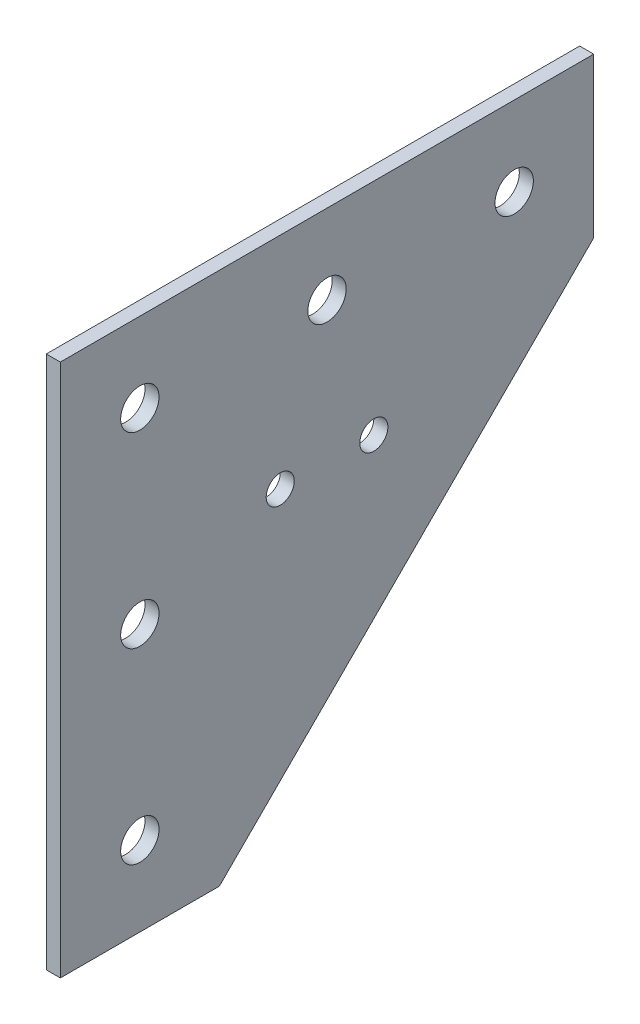
ISO-10303-21;
HEADER;
FILE_DESCRIPTION(('STEP AP214'),'2;1');
FILE_NAME('part.step','',(''),(''),'','','');
FILE_SCHEMA(('AUTOMOTIVE_DESIGN { 1 0 10303 214 1 1 1 1 }'));
ENDSEC;
DATA;
#1=APPLICATION_CONTEXT('core data for automotive mechanical design processes');
#2=APPLICATION_PROTOCOL_DEFINITION('international standard','automotive_design',2000,#1);
#3=PRODUCT_CONTEXT('',#1,'mechanical');
#4=PRODUCT('Part','Part','',(#3));
#5=PRODUCT_RELATED_PRODUCT_CATEGORY('part','',(#4));
#6=PRODUCT_DEFINITION_FORMATION('','',#4);
#7=PRODUCT_DEFINITION_CONTEXT('part definition',#1,'design');
#8=PRODUCT_DEFINITION('design','',#6,#7);
#9=PRODUCT_DEFINITION_SHAPE('','',#8);
#10=(LENGTH_UNIT() NAMED_UNIT(*) SI_UNIT(.MILLI.,.METRE.));
#11=(NAMED_UNIT(*) PLANE_ANGLE_UNIT() SI_UNIT($,.RADIAN.));
#12=(NAMED_UNIT(*) SI_UNIT($,.STERADIAN.) SOLID_ANGLE_UNIT());
#13=UNCERTAINTY_MEASURE_WITH_UNIT(LENGTH_MEASURE(1.E-05),#10,'distance_accuracy_value','');
#14=(GEOMETRIC_REPRESENTATION_CONTEXT(3) GLOBAL_UNCERTAINTY_ASSIGNED_CONTEXT((#13)) GLOBAL_UNIT_ASSIGNED_CONTEXT((#10,
#11,#12)) REPRESENTATION_CONTEXT('',''));
#15=CARTESIAN_POINT('',(0.,0.,0.));
#16=DIRECTION('',(0.,0.,1.));
#17=DIRECTION('',(1.,0.,0.));
#18=AXIS2_PLACEMENT_3D('',#15,#16,#17);
#19=CARTESIAN_POINT('',(3.,57.,-57.));
#20=DIRECTION('',(0.,0.,1.));
#21=DIRECTION('',(0.,-1.,0.));
#22=AXIS2_PLACEMENT_3D('',#19,#20,#21);
#23=PLANE('',#22);
#24=DIRECTION('',(0.,1.,0.));
#25=VECTOR('',#24,1.);
#26=CARTESIAN_POINT('',(3.,57.,-57.));
#27=LINE('',#26,#25);
#28=CARTESIAN_POINT('',(3.,23.,-57.));
#29=VERTEX_POINT('',#28);
#30=CARTESIAN_POINT('',(3.,57.,-57.));
#31=VERTEX_POINT('',#30);
#32=EDGE_CURVE('E81',#29,#31,#27,.T.);
#33=ORIENTED_EDGE('',*,*,#32,.F.);
#34=DIRECTION('',(1.,0.,0.));
#35=VECTOR('',#34,1.);
#36=CARTESIAN_POINT('',(0.,23.,-57.));
#37=LINE('',#36,#35);
#38=CARTESIAN_POINT('',(0.,23.,-57.));
#39=VERTEX_POINT('',#38);
#40=EDGE_CURVE('E92',#39,#29,#37,.T.);
#41=ORIENTED_EDGE('',*,*,#40,.F.);
#42=DIRECTION('',(0.,1.,0.));
#43=VECTOR('',#42,1.);
#44=CARTESIAN_POINT('',(0.,57.,-57.));
#45=LINE('',#44,#43);
#46=CARTESIAN_POINT('',(0.,57.,-57.));
#47=VERTEX_POINT('',#46);
#48=EDGE_CURVE('E101',#39,#47,#45,.T.);
#49=ORIENTED_EDGE('',*,*,#48,.T.);
#50=DIRECTION('',(-1.,0.,0.));
#51=VECTOR('',#50,1.);
#52=CARTESIAN_POINT('',(3.,57.,-57.));
#53=LINE('',#52,#51);
#54=EDGE_CURVE('E11',#31,#47,#53,.T.);
#55=ORIENTED_EDGE('',*,*,#54,.F.);
#56=EDGE_LOOP('',(#33,#41,#49,#55));
#57=FACE_BOUND('',#56,.T.);
#58=ADVANCED_FACE('F36',(#57),#23,.F.);
#59=CARTESIAN_POINT('',(3.,57.,57.));
#60=DIRECTION('',(0.,-1.,0.));
#61=DIRECTION('',(0.,0.,-1.));
#62=AXIS2_PLACEMENT_3D('',#59,#60,#61);
#63=PLANE('',#62);
#64=DIRECTION('',(0.,0.,1.));
#65=VECTOR('',#64,1.);
#66=CARTESIAN_POINT('',(0.,57.,57.));
#67=LINE('',#66,#65);
#68=CARTESIAN_POINT('',(0.,57.,57.));
#69=VERTEX_POINT('',#68);
#70=EDGE_CURVE('E106',#47,#69,#67,.T.);
#71=ORIENTED_EDGE('',*,*,#70,.T.);
#72=DIRECTION('',(-1.,0.,0.));
#73=VECTOR('',#72,1.);
#74=CARTESIAN_POINT('',(3.,57.,57.));
#75=LINE('',#74,#73);
#76=CARTESIAN_POINT('',(3.,57.,57.));
#77=VERTEX_POINT('',#76);
#78=EDGE_CURVE('E43',#77,#69,#75,.T.);
#79=ORIENTED_EDGE('',*,*,#78,.F.);
#80=DIRECTION('',(0.,0.,1.));
#81=VECTOR('',#80,1.);
#82=CARTESIAN_POINT('',(3.,57.,57.));
#83=LINE('',#82,#81);
#84=EDGE_CURVE('E127',#31,#77,#83,.T.);
#85=ORIENTED_EDGE('',*,*,#84,.F.);
#86=ORIENTED_EDGE('',*,*,#54,.T.);
#87=EDGE_LOOP('',(#71,#79,#85,#86));
#88=FACE_BOUND('',#87,.T.);
#89=ADVANCED_FACE('F212',(#88),#63,.F.);
#90=CARTESIAN_POINT('',(3.,57.,57.));
#91=DIRECTION('',(0.,0.,-1.));
#92=DIRECTION('',(0.,1.,0.));
#93=AXIS2_PLACEMENT_3D('',#90,#91,#92);
#94=PLANE('',#93);
#95=DIRECTION('',(0.,-1.,0.));
#96=VECTOR('',#95,1.);
#97=CARTESIAN_POINT('',(0.,57.,57.));
#98=LINE('',#97,#96);
#99=CARTESIAN_POINT('',(0.,-57.,57.));
#100=VERTEX_POINT('',#99);
#101=EDGE_CURVE('E76',#69,#100,#98,.T.);
#102=ORIENTED_EDGE('',*,*,#101,.T.);
#103=DIRECTION('',(-1.,0.,0.));
#104=VECTOR('',#103,1.);
#105=CARTESIAN_POINT('',(3.,-57.,57.));
#106=LINE('',#105,#104);
#107=CARTESIAN_POINT('',(3.,-57.,57.));
#108=VERTEX_POINT('',#107);
#109=EDGE_CURVE('E120',#108,#100,#106,.T.);
#110=ORIENTED_EDGE('',*,*,#109,.F.);
#111=DIRECTION('',(0.,-1.,0.));
#112=VECTOR('',#111,1.);
#113=CARTESIAN_POINT('',(3.,57.,57.));
#114=LINE('',#113,#112);
#115=EDGE_CURVE('E59',#77,#108,#114,.T.);
#116=ORIENTED_EDGE('',*,*,#115,.F.);
#117=ORIENTED_EDGE('',*,*,#78,.T.);
#118=EDGE_LOOP('',(#102,#110,#116,#117));
#119=FACE_BOUND('',#118,.T.);
#120=ADVANCED_FACE('F122',(#119),#94,.F.);
#121=CARTESIAN_POINT('',(3.,-57.,57.));
#122=DIRECTION('',(0.,1.,0.));
#123=DIRECTION('',(0.,0.,1.));
#124=AXIS2_PLACEMENT_3D('',#121,#122,#123);
#125=PLANE('',#124);
#126=DIRECTION('',(0.,0.,-1.));
#127=VECTOR('',#126,1.);
#128=CARTESIAN_POINT('',(0.,-57.,57.));
#129=LINE('',#128,#127);
#130=CARTESIAN_POINT('',(0.,-57.,23.));
#131=VERTEX_POINT('',#130);
#132=EDGE_CURVE('E118',#100,#131,#129,.T.);
#133=ORIENTED_EDGE('',*,*,#132,.T.);
#134=DIRECTION('',(1.,0.,0.));
#135=VECTOR('',#134,1.);
#136=CARTESIAN_POINT('',(0.,-57.,23.));
#137=LINE('',#136,#135);
#138=CARTESIAN_POINT('',(3.,-57.,23.));
#139=VERTEX_POINT('',#138);
#140=EDGE_CURVE('E50',#131,#139,#137,.T.);
#141=ORIENTED_EDGE('',*,*,#140,.T.);
#142=DIRECTION('',(0.,0.,-1.));
#143=VECTOR('',#142,1.);
#144=CARTESIAN_POINT('',(3.,-57.,57.));
#145=LINE('',#144,#143);
#146=EDGE_CURVE('E114',#108,#139,#145,.T.);
#147=ORIENTED_EDGE('',*,*,#146,.F.);
#148=ORIENTED_EDGE('',*,*,#109,.T.);
#149=EDGE_LOOP('',(#133,#141,#147,#148));
#150=FACE_BOUND('',#149,.T.);
#151=ADVANCED_FACE('F125',(#150),#125,.F.);
#152=CARTESIAN_POINT('',(3.,0.,0.));
#153=DIRECTION('',(1.,0.,0.));
#154=DIRECTION('',(0.,0.,-1.));
#155=AXIS2_PLACEMENT_3D('',#152,#153,#154);
#156=PLANE('',#155);
#157=CARTESIAN_POINT('',(3.,10.,10.));
#158=DIRECTION('',(1.,0.,0.));
#159=DIRECTION('',(0.,0.,-1.));
#160=AXIS2_PLACEMENT_3D('',#157,#158,#159);
#161=CIRCLE('',#160,3.);
#162=CARTESIAN_POINT('',(3.,10.,7.00000000000002));
#163=VERTEX_POINT('',#162);
#164=EDGE_CURVE('E165',#163,#163,#161,.T.);
#165=ORIENTED_EDGE('',*,*,#164,.F.);
#166=EDGE_LOOP('',(#165));
#167=FACE_BOUND('',#166,.T.);
#168=CARTESIAN_POINT('',(3.,10.,-10.0000000000003));
#169=DIRECTION('',(1.,0.,0.));
#170=DIRECTION('',(0.,0.,-1.));
#171=AXIS2_PLACEMENT_3D('',#168,#169,#170);
#172=CIRCLE('',#171,3.);
#173=CARTESIAN_POINT('',(3.,10.,-13.0000000000003));
#174=VERTEX_POINT('',#173);
#175=EDGE_CURVE('E159',#174,#174,#172,.T.);
#176=ORIENTED_EDGE('',*,*,#175,.F.);
#177=EDGE_LOOP('',(#176));
#178=FACE_BOUND('',#177,.T.);
#179=DIRECTION('',(0.,-0.707106781186548,0.707106781186548));
#180=VECTOR('',#179,1.);
#181=CARTESIAN_POINT('',(3.,-57.,23.));
#182=LINE('',#181,#180);
#183=EDGE_CURVE('E97',#29,#139,#182,.T.);
#184=ORIENTED_EDGE('',*,*,#183,.F.);
#185=ORIENTED_EDGE('',*,*,#32,.T.);
#186=ORIENTED_EDGE('',*,*,#84,.T.);
#187=ORIENTED_EDGE('',*,*,#115,.T.);
#188=ORIENTED_EDGE('',*,*,#146,.T.);
#189=EDGE_LOOP('',(#184,#185,#186,#187,#188));
#190=FACE_BOUND('',#189,.T.);
#191=CARTESIAN_POINT('',(3.,-40.,40.));
#192=DIRECTION('',(1.,0.,0.));
#193=DIRECTION('',(0.,0.,-1.));
#194=AXIS2_PLACEMENT_3D('',#191,#192,#193);
#195=CIRCLE('',#194,4.1);
#196=CARTESIAN_POINT('',(3.,-40.,35.9));
#197=VERTEX_POINT('',#196);
#198=EDGE_CURVE('E103',#197,#197,#195,.T.);
#199=ORIENTED_EDGE('',*,*,#198,.F.);
#200=EDGE_LOOP('',(#199));
#201=FACE_BOUND('',#200,.T.);
#202=CARTESIAN_POINT('',(3.,0.,40.));
#203=DIRECTION('',(1.,0.,0.));
#204=DIRECTION('',(0.,0.,-1.));
#205=AXIS2_PLACEMENT_3D('',#202,#203,#204);
#206=CIRCLE('',#205,4.1);
#207=CARTESIAN_POINT('',(3.,0.,35.9));
#208=VERTEX_POINT('',#207);
#209=EDGE_CURVE('E139',#208,#208,#206,.T.);
#210=ORIENTED_EDGE('',*,*,#209,.F.);
#211=EDGE_LOOP('',(#210));
#212=FACE_BOUND('',#211,.T.);
#213=CARTESIAN_POINT('',(3.,40.,-40.));
#214=DIRECTION('',(1.,0.,0.));
#215=DIRECTION('',(0.,0.,-1.));
#216=AXIS2_PLACEMENT_3D('',#213,#214,#215);
#217=CIRCLE('',#216,4.1);
#218=CARTESIAN_POINT('',(3.,40.,-44.1));
#219=VERTEX_POINT('',#218);
#220=EDGE_CURVE('E145',#219,#219,#217,.T.);
#221=ORIENTED_EDGE('',*,*,#220,.F.);
#222=EDGE_LOOP('',(#221));
#223=FACE_BOUND('',#222,.T.);
#224=CARTESIAN_POINT('',(3.,40.,0.));
#225=DIRECTION('',(1.,0.,0.));
#226=DIRECTION('',(0.,0.,-1.));
#227=AXIS2_PLACEMENT_3D('',#224,#225,#226);
#228=CIRCLE('',#227,4.1);
#229=CARTESIAN_POINT('',(3.,40.,-4.09999999999999));
#230=VERTEX_POINT('',#229);
#231=EDGE_CURVE('E151',#230,#230,#228,.T.);
#232=ORIENTED_EDGE('',*,*,#231,.F.);
#233=EDGE_LOOP('',(#232));
#234=FACE_BOUND('',#233,.T.);
#235=CARTESIAN_POINT('',(3.,40.,40.));
#236=DIRECTION('',(1.,0.,0.));
#237=DIRECTION('',(0.,0.,-1.));
#238=AXIS2_PLACEMENT_3D('',#235,#236,#237);
#239=CIRCLE('',#238,4.1);
#240=CARTESIAN_POINT('',(3.,40.,35.9));
#241=VERTEX_POINT('',#240);
#242=EDGE_CURVE('E111',#241,#241,#239,.T.);
#243=ORIENTED_EDGE('',*,*,#242,.F.);
#244=EDGE_LOOP('',(#243));
#245=FACE_BOUND('',#244,.T.);
#246=ADVANCED_FACE('F180',(#167,#178,#190,#201,#212,#223,#234,#245),#156,.T.);
#247=CARTESIAN_POINT('',(0.,0.,0.));
#248=DIRECTION('',(1.,0.,0.));
#249=DIRECTION('',(0.,0.,-1.));
#250=AXIS2_PLACEMENT_3D('',#247,#248,#249);
#251=PLANE('',#250);
#252=CARTESIAN_POINT('',(0.,10.,10.));
#253=DIRECTION('',(1.,0.,0.));
#254=DIRECTION('',(0.,0.,-1.));
#255=AXIS2_PLACEMENT_3D('',#252,#253,#254);
#256=CIRCLE('',#255,3.);
#257=CARTESIAN_POINT('',(0.,10.,7.00000000000002));
#258=VERTEX_POINT('',#257);
#259=EDGE_CURVE('E157',#258,#258,#256,.T.);
#260=ORIENTED_EDGE('',*,*,#259,.T.);
#261=EDGE_LOOP('',(#260));
#262=FACE_BOUND('',#261,.T.);
#263=CARTESIAN_POINT('',(0.,10.,-10.0000000000003));
#264=DIRECTION('',(1.,0.,0.));
#265=DIRECTION('',(0.,0.,-1.));
#266=AXIS2_PLACEMENT_3D('',#263,#264,#265);
#267=CIRCLE('',#266,3.);
#268=CARTESIAN_POINT('',(0.,10.,-13.0000000000003));
#269=VERTEX_POINT('',#268);
#270=EDGE_CURVE('E162',#269,#269,#267,.T.);
#271=ORIENTED_EDGE('',*,*,#270,.T.);
#272=EDGE_LOOP('',(#271));
#273=FACE_BOUND('',#272,.T.);
#274=CARTESIAN_POINT('',(0.,-40.,40.));
#275=DIRECTION('',(1.,0.,0.));
#276=DIRECTION('',(0.,0.,-1.));
#277=AXIS2_PLACEMENT_3D('',#274,#275,#276);
#278=CIRCLE('',#277,4.1);
#279=CARTESIAN_POINT('',(0.,-40.,35.9));
#280=VERTEX_POINT('',#279);
#281=EDGE_CURVE('E136',#280,#280,#278,.T.);
#282=ORIENTED_EDGE('',*,*,#281,.T.);
#283=EDGE_LOOP('',(#282));
#284=FACE_BOUND('',#283,.T.);
#285=CARTESIAN_POINT('',(0.,0.,40.));
#286=DIRECTION('',(1.,0.,0.));
#287=DIRECTION('',(0.,0.,-1.));
#288=AXIS2_PLACEMENT_3D('',#285,#286,#287);
#289=CIRCLE('',#288,4.1);
#290=CARTESIAN_POINT('',(0.,0.,35.9));
#291=VERTEX_POINT('',#290);
#292=EDGE_CURVE('E142',#291,#291,#289,.T.);
#293=ORIENTED_EDGE('',*,*,#292,.T.);
#294=EDGE_LOOP('',(#293));
#295=FACE_BOUND('',#294,.T.);
#296=CARTESIAN_POINT('',(0.,40.,-40.));
#297=DIRECTION('',(1.,0.,0.));
#298=DIRECTION('',(0.,0.,-1.));
#299=AXIS2_PLACEMENT_3D('',#296,#297,#298);
#300=CIRCLE('',#299,4.1);
#301=CARTESIAN_POINT('',(0.,40.,-44.1));
#302=VERTEX_POINT('',#301);
#303=EDGE_CURVE('E148',#302,#302,#300,.T.);
#304=ORIENTED_EDGE('',*,*,#303,.T.);
#305=EDGE_LOOP('',(#304));
#306=FACE_BOUND('',#305,.T.);
#307=CARTESIAN_POINT('',(0.,40.,0.));
#308=DIRECTION('',(1.,0.,0.));
#309=DIRECTION('',(0.,0.,-1.));
#310=AXIS2_PLACEMENT_3D('',#307,#308,#309);
#311=CIRCLE('',#310,4.1);
#312=CARTESIAN_POINT('',(0.,40.,-4.09999999999999));
#313=VERTEX_POINT('',#312);
#314=EDGE_CURVE('E132',#313,#313,#311,.T.);
#315=ORIENTED_EDGE('',*,*,#314,.T.);
#316=EDGE_LOOP('',(#315));
#317=FACE_BOUND('',#316,.T.);
#318=CARTESIAN_POINT('',(0.,40.,40.));
#319=DIRECTION('',(1.,0.,0.));
#320=DIRECTION('',(0.,0.,-1.));
#321=AXIS2_PLACEMENT_3D('',#318,#319,#320);
#322=CIRCLE('',#321,4.1);
#323=CARTESIAN_POINT('',(0.,40.,35.9));
#324=VERTEX_POINT('',#323);
#325=EDGE_CURVE('E107',#324,#324,#322,.T.);
#326=ORIENTED_EDGE('',*,*,#325,.T.);
#327=EDGE_LOOP('',(#326));
#328=FACE_BOUND('',#327,.T.);
#329=ORIENTED_EDGE('',*,*,#48,.F.);
#330=DIRECTION('',(0.,-0.707106781186548,0.707106781186548));
#331=VECTOR('',#330,1.);
#332=CARTESIAN_POINT('',(0.,-57.,23.));
#333=LINE('',#332,#331);
#334=EDGE_CURVE('E89',#39,#131,#333,.T.);
#335=ORIENTED_EDGE('',*,*,#334,.T.);
#336=ORIENTED_EDGE('',*,*,#132,.F.);
#337=ORIENTED_EDGE('',*,*,#101,.F.);
#338=ORIENTED_EDGE('',*,*,#70,.F.);
#339=EDGE_LOOP('',(#329,#335,#336,#337,#338));
#340=FACE_BOUND('',#339,.T.);
#341=ADVANCED_FACE('F105',(#262,#273,#284,#295,#306,#317,#328,#340),#251,.F.);
#342=CARTESIAN_POINT('',(0.,40.,40.));
#343=DIRECTION('',(1.,0.,0.));
#344=DIRECTION('',(0.,0.,-1.));
#345=AXIS2_PLACEMENT_3D('',#342,#343,#344);
#346=CYLINDRICAL_SURFACE('',#345,4.1);
#347=ORIENTED_EDGE('',*,*,#325,.F.);
#348=EDGE_LOOP('',(#347));
#349=FACE_BOUND('',#348,.T.);
#350=ORIENTED_EDGE('',*,*,#242,.T.);
#351=EDGE_LOOP('',(#350));
#352=FACE_BOUND('',#351,.T.);
#353=ADVANCED_FACE('F196',(#349,#352),#346,.F.);
#354=CARTESIAN_POINT('',(0.,40.,0.));
#355=DIRECTION('',(1.,0.,0.));
#356=DIRECTION('',(0.,0.,-1.));
#357=AXIS2_PLACEMENT_3D('',#354,#355,#356);
#358=CYLINDRICAL_SURFACE('',#357,4.1);
#359=ORIENTED_EDGE('',*,*,#314,.F.);
#360=EDGE_LOOP('',(#359));
#361=FACE_BOUND('',#360,.T.);
#362=ORIENTED_EDGE('',*,*,#231,.T.);
#363=EDGE_LOOP('',(#362));
#364=FACE_BOUND('',#363,.T.);
#365=ADVANCED_FACE('F198',(#361,#364),#358,.F.);
#366=CARTESIAN_POINT('',(0.,40.,-40.));
#367=DIRECTION('',(1.,0.,0.));
#368=DIRECTION('',(0.,0.,-1.));
#369=AXIS2_PLACEMENT_3D('',#366,#367,#368);
#370=CYLINDRICAL_SURFACE('',#369,4.1);
#371=ORIENTED_EDGE('',*,*,#303,.F.);
#372=EDGE_LOOP('',(#371));
#373=FACE_BOUND('',#372,.T.);
#374=ORIENTED_EDGE('',*,*,#220,.T.);
#375=EDGE_LOOP('',(#374));
#376=FACE_BOUND('',#375,.T.);
#377=ADVANCED_FACE('F205',(#373,#376),#370,.F.);
#378=CARTESIAN_POINT('',(0.,0.,40.));
#379=DIRECTION('',(1.,0.,0.));
#380=DIRECTION('',(0.,0.,-1.));
#381=AXIS2_PLACEMENT_3D('',#378,#379,#380);
#382=CYLINDRICAL_SURFACE('',#381,4.1);
#383=ORIENTED_EDGE('',*,*,#292,.F.);
#384=EDGE_LOOP('',(#383));
#385=FACE_BOUND('',#384,.T.);
#386=ORIENTED_EDGE('',*,*,#209,.T.);
#387=EDGE_LOOP('',(#386));
#388=FACE_BOUND('',#387,.T.);
#389=ADVANCED_FACE('F265',(#385,#388),#382,.F.);
#390=CARTESIAN_POINT('',(0.,-40.,40.));
#391=DIRECTION('',(1.,0.,0.));
#392=DIRECTION('',(0.,0.,-1.));
#393=AXIS2_PLACEMENT_3D('',#390,#391,#392);
#394=CYLINDRICAL_SURFACE('',#393,4.1);
#395=ORIENTED_EDGE('',*,*,#281,.F.);
#396=EDGE_LOOP('',(#395));
#397=FACE_BOUND('',#396,.T.);
#398=ORIENTED_EDGE('',*,*,#198,.T.);
#399=EDGE_LOOP('',(#398));
#400=FACE_BOUND('',#399,.T.);
#401=ADVANCED_FACE('F259',(#397,#400),#394,.F.);
#402=CARTESIAN_POINT('',(0.,-57.,23.));
#403=DIRECTION('',(0.,0.707106781186547,0.707106781186547));
#404=DIRECTION('',(0.,-0.707106781186548,0.707106781186548));
#405=AXIS2_PLACEMENT_3D('',#402,#403,#404);
#406=PLANE('',#405);
#407=ORIENTED_EDGE('',*,*,#183,.T.);
#408=ORIENTED_EDGE('',*,*,#140,.F.);
#409=ORIENTED_EDGE('',*,*,#334,.F.);
#410=ORIENTED_EDGE('',*,*,#40,.T.);
#411=EDGE_LOOP('',(#407,#408,#409,#410));
#412=FACE_BOUND('',#411,.T.);
#413=ADVANCED_FACE('F91',(#412),#406,.F.);
#414=CARTESIAN_POINT('',(0.,10.,-10.0000000000003));
#415=DIRECTION('',(1.,0.,0.));
#416=DIRECTION('',(0.,0.,-1.));
#417=AXIS2_PLACEMENT_3D('',#414,#415,#416);
#418=CYLINDRICAL_SURFACE('',#417,3.);
#419=ORIENTED_EDGE('',*,*,#270,.F.);
#420=EDGE_LOOP('',(#419));
#421=FACE_BOUND('',#420,.T.);
#422=ORIENTED_EDGE('',*,*,#175,.T.);
#423=EDGE_LOOP('',(#422));
#424=FACE_BOUND('',#423,.T.);
#425=ADVANCED_FACE('F176',(#421,#424),#418,.F.);
#426=CARTESIAN_POINT('',(0.,10.,10.));
#427=DIRECTION('',(1.,0.,0.));
#428=DIRECTION('',(0.,0.,-1.));
#429=AXIS2_PLACEMENT_3D('',#426,#427,#428);
#430=CYLINDRICAL_SURFACE('',#429,3.);
#431=ORIENTED_EDGE('',*,*,#259,.F.);
#432=EDGE_LOOP('',(#431));
#433=FACE_BOUND('',#432,.T.);
#434=ORIENTED_EDGE('',*,*,#164,.T.);
#435=EDGE_LOOP('',(#434));
#436=FACE_BOUND('',#435,.T.);
#437=ADVANCED_FACE('F173',(#433,#436),#430,.F.);
#438=CLOSED_SHELL('',(#58,#89,#120,#151,#246,#341,#353,#365,#377,#389,#401,#413,#425,#437));
#439=MANIFOLD_SOLID_BREP('B2',#438);
#440=ADVANCED_BREP_SHAPE_REPRESENTATION('',(#18,#439),#14);
#441=SHAPE_DEFINITION_REPRESENTATION(#9,#440);
ENDSEC;
END-ISO-10303-21;
